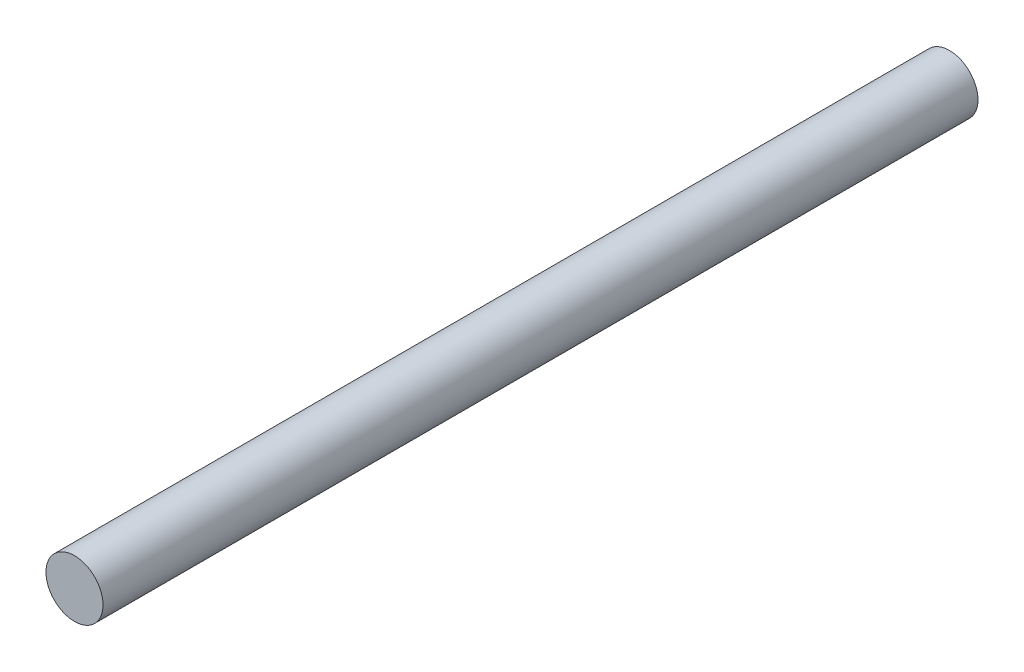
ISO-10303-21;
HEADER;
FILE_DESCRIPTION(('STEP AP214'),'2;1');
FILE_NAME('part.step','',(''),(''),'','','');
FILE_SCHEMA(('AUTOMOTIVE_DESIGN { 1 0 10303 214 1 1 1 1 }'));
ENDSEC;
DATA;
#1=APPLICATION_CONTEXT('core data for automotive mechanical design processes');
#2=APPLICATION_PROTOCOL_DEFINITION('international standard','automotive_design',2000,#1);
#3=PRODUCT_CONTEXT('',#1,'mechanical');
#4=PRODUCT('Part','Part','',(#3));
#5=PRODUCT_RELATED_PRODUCT_CATEGORY('part','',(#4));
#6=PRODUCT_DEFINITION_FORMATION('','',#4);
#7=PRODUCT_DEFINITION_CONTEXT('part definition',#1,'design');
#8=PRODUCT_DEFINITION('design','',#6,#7);
#9=PRODUCT_DEFINITION_SHAPE('','',#8);
#10=(LENGTH_UNIT() NAMED_UNIT(*) SI_UNIT(.MILLI.,.METRE.));
#11=(NAMED_UNIT(*) PLANE_ANGLE_UNIT() SI_UNIT($,.RADIAN.));
#12=(NAMED_UNIT(*) SI_UNIT($,.STERADIAN.) SOLID_ANGLE_UNIT());
#13=UNCERTAINTY_MEASURE_WITH_UNIT(LENGTH_MEASURE(1.E-05),#10,'distance_accuracy_value','');
#14=(GEOMETRIC_REPRESENTATION_CONTEXT(3) GLOBAL_UNCERTAINTY_ASSIGNED_CONTEXT((#13)) GLOBAL_UNIT_ASSIGNED_CONTEXT((#10,
#11,#12)) REPRESENTATION_CONTEXT('',''));
#15=CARTESIAN_POINT('',(0.,0.,0.));
#16=DIRECTION('',(0.,0.,1.));
#17=DIRECTION('',(1.,0.,0.));
#18=AXIS2_PLACEMENT_3D('',#15,#16,#17);
#19=CARTESIAN_POINT('',(0.,0.,46.));
#20=DIRECTION('',(0.,0.,-1.));
#21=DIRECTION('',(-1.,0.,0.));
#22=AXIS2_PLACEMENT_3D('',#19,#20,#21);
#23=CYLINDRICAL_SURFACE('',#22,1.5);
#24=CARTESIAN_POINT('',(0.,0.,46.));
#25=DIRECTION('',(0.,0.,1.));
#26=DIRECTION('',(1.,0.,0.));
#27=AXIS2_PLACEMENT_3D('',#24,#25,#26);
#28=CIRCLE('',#27,1.5);
#29=CARTESIAN_POINT('',(1.5,0.,46.));
#30=VERTEX_POINT('',#29);
#31=EDGE_CURVE('E10',#30,#30,#28,.T.);
#32=ORIENTED_EDGE('',*,*,#31,.F.);
#33=EDGE_LOOP('',(#32));
#34=FACE_BOUND('',#33,.T.);
#35=CARTESIAN_POINT('',(0.,0.,0.));
#36=DIRECTION('',(0.,0.,1.));
#37=DIRECTION('',(1.,0.,0.));
#38=AXIS2_PLACEMENT_3D('',#35,#36,#37);
#39=CIRCLE('',#38,1.5);
#40=CARTESIAN_POINT('',(1.5,0.,0.));
#41=VERTEX_POINT('',#40);
#42=EDGE_CURVE('E37',#41,#41,#39,.T.);
#43=ORIENTED_EDGE('',*,*,#42,.T.);
#44=EDGE_LOOP('',(#43));
#45=FACE_BOUND('',#44,.T.);
#46=ADVANCED_FACE('F40',(#34,#45),#23,.T.);
#47=CARTESIAN_POINT('',(0.,0.,46.));
#48=DIRECTION('',(0.,0.,1.));
#49=DIRECTION('',(1.,0.,0.));
#50=AXIS2_PLACEMENT_3D('',#47,#48,#49);
#51=PLANE('',#50);
#52=ORIENTED_EDGE('',*,*,#31,.T.);
#53=EDGE_LOOP('',(#52));
#54=FACE_BOUND('',#53,.T.);
#55=ADVANCED_FACE('F55',(#54),#51,.T.);
#56=CARTESIAN_POINT('',(0.,0.,0.));
#57=DIRECTION('',(0.,0.,1.));
#58=DIRECTION('',(1.,0.,0.));
#59=AXIS2_PLACEMENT_3D('',#56,#57,#58);
#60=PLANE('',#59);
#61=ORIENTED_EDGE('',*,*,#42,.F.);
#62=EDGE_LOOP('',(#61));
#63=FACE_BOUND('',#62,.T.);
#64=ADVANCED_FACE('F49',(#63),#60,.F.);
#65=CLOSED_SHELL('',(#46,#55,#64));
#66=MANIFOLD_SOLID_BREP('B2',#65);
#67=ADVANCED_BREP_SHAPE_REPRESENTATION('',(#18,#66),#14);
#68=SHAPE_DEFINITION_REPRESENTATION(#9,#67);
ENDSEC;
END-ISO-10303-21;
